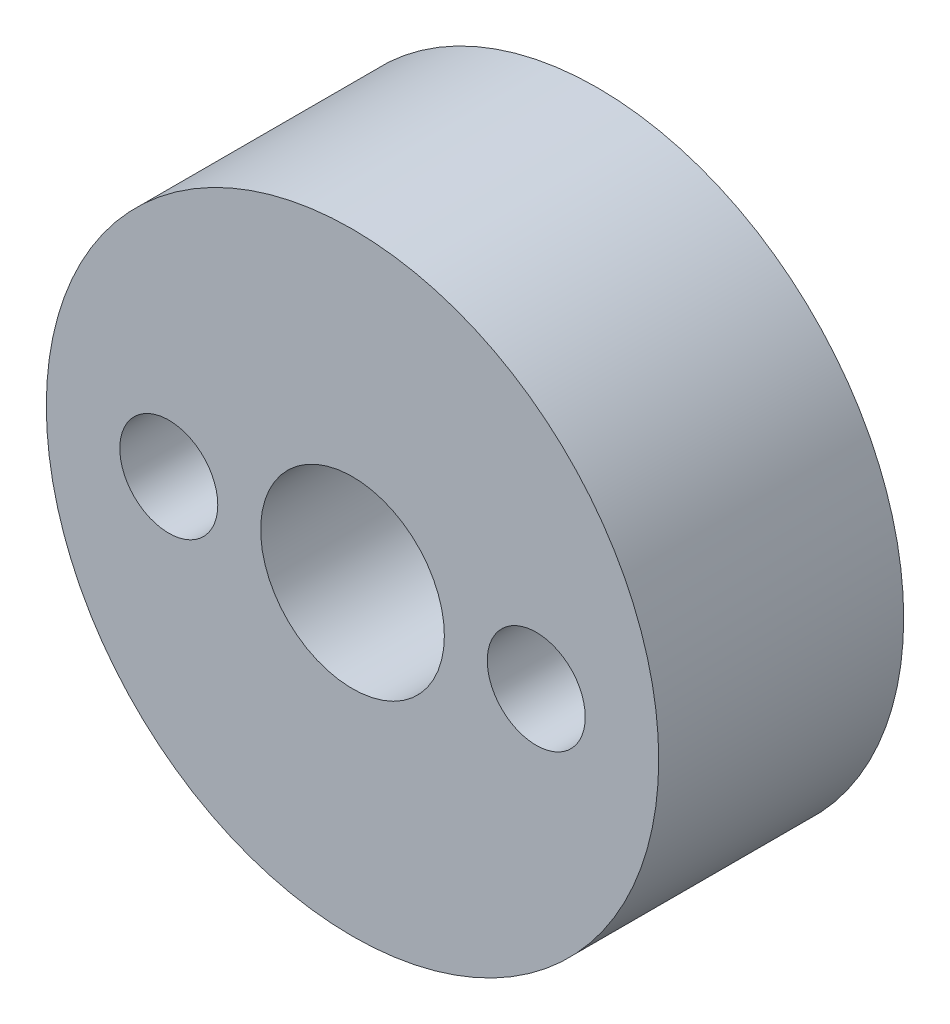
ISO-10303-21;
HEADER;
FILE_DESCRIPTION(('STEP AP214'),'2;1');
FILE_NAME('part.step','',(''),(''),'','','');
FILE_SCHEMA(('AUTOMOTIVE_DESIGN { 1 0 10303 214 1 1 1 1 }'));
ENDSEC;
DATA;
#1=APPLICATION_CONTEXT('core data for automotive mechanical design processes');
#2=APPLICATION_PROTOCOL_DEFINITION('international standard','automotive_design',2000,#1);
#3=PRODUCT_CONTEXT('',#1,'mechanical');
#4=PRODUCT('Part','Part','',(#3));
#5=PRODUCT_RELATED_PRODUCT_CATEGORY('part','',(#4));
#6=PRODUCT_DEFINITION_FORMATION('','',#4);
#7=PRODUCT_DEFINITION_CONTEXT('part definition',#1,'design');
#8=PRODUCT_DEFINITION('design','',#6,#7);
#9=PRODUCT_DEFINITION_SHAPE('','',#8);
#10=(LENGTH_UNIT() NAMED_UNIT(*) SI_UNIT(.MILLI.,.METRE.));
#11=(NAMED_UNIT(*) PLANE_ANGLE_UNIT() SI_UNIT($,.RADIAN.));
#12=(NAMED_UNIT(*) SI_UNIT($,.STERADIAN.) SOLID_ANGLE_UNIT());
#13=UNCERTAINTY_MEASURE_WITH_UNIT(LENGTH_MEASURE(1.E-05),#10,'distance_accuracy_value','');
#14=(GEOMETRIC_REPRESENTATION_CONTEXT(3) GLOBAL_UNCERTAINTY_ASSIGNED_CONTEXT((#13)) GLOBAL_UNIT_ASSIGNED_CONTEXT((#10,
#11,#12)) REPRESENTATION_CONTEXT('',''));
#15=CARTESIAN_POINT('',(0.,0.,0.));
#16=DIRECTION('',(0.,0.,1.));
#17=DIRECTION('',(1.,0.,0.));
#18=AXIS2_PLACEMENT_3D('',#15,#16,#17);
#19=CARTESIAN_POINT('',(0.,0.,8.));
#20=DIRECTION('',(0.,0.,1.));
#21=DIRECTION('',(1.,0.,0.));
#22=AXIS2_PLACEMENT_3D('',#19,#20,#21);
#23=PLANE('',#22);
#24=CARTESIAN_POINT('',(-6.,0.,8.));
#25=DIRECTION('',(0.,0.,1.));
#26=DIRECTION('',(1.,0.,0.));
#27=AXIS2_PLACEMENT_3D('',#24,#25,#26);
#28=CIRCLE('',#27,1.6);
#29=CARTESIAN_POINT('',(-4.4,0.,8.));
#30=VERTEX_POINT('',#29);
#31=EDGE_CURVE('E47',#30,#30,#28,.T.);
#32=ORIENTED_EDGE('',*,*,#31,.F.);
#33=EDGE_LOOP('',(#32));
#34=FACE_BOUND('',#33,.T.);
#35=CARTESIAN_POINT('',(0.,0.,8.));
#36=DIRECTION('',(0.,0.,1.));
#37=DIRECTION('',(1.,0.,0.));
#38=AXIS2_PLACEMENT_3D('',#35,#36,#37);
#39=CIRCLE('',#38,10.);
#40=CARTESIAN_POINT('',(10.,0.,8.));
#41=VERTEX_POINT('',#40);
#42=EDGE_CURVE('E10',#41,#41,#39,.T.);
#43=ORIENTED_EDGE('',*,*,#42,.T.);
#44=EDGE_LOOP('',(#43));
#45=FACE_BOUND('',#44,.T.);
#46=CARTESIAN_POINT('',(0.,0.,8.));
#47=DIRECTION('',(0.,0.,1.));
#48=DIRECTION('',(1.,0.,0.));
#49=AXIS2_PLACEMENT_3D('',#46,#47,#48);
#50=CIRCLE('',#49,3.);
#51=CARTESIAN_POINT('',(3.,0.,8.));
#52=VERTEX_POINT('',#51);
#53=EDGE_CURVE('E42',#52,#52,#50,.T.);
#54=ORIENTED_EDGE('',*,*,#53,.F.);
#55=EDGE_LOOP('',(#54));
#56=FACE_BOUND('',#55,.T.);
#57=CARTESIAN_POINT('',(6.,0.,8.));
#58=DIRECTION('',(0.,0.,1.));
#59=DIRECTION('',(1.,0.,0.));
#60=AXIS2_PLACEMENT_3D('',#57,#58,#59);
#61=CIRCLE('',#60,1.6);
#62=CARTESIAN_POINT('',(7.6,0.,8.));
#63=VERTEX_POINT('',#62);
#64=EDGE_CURVE('E53',#63,#63,#61,.T.);
#65=ORIENTED_EDGE('',*,*,#64,.F.);
#66=EDGE_LOOP('',(#65));
#67=FACE_BOUND('',#66,.T.);
#68=ADVANCED_FACE('F31',(#34,#45,#56,#67),#23,.T.);
#69=CARTESIAN_POINT('',(0.,0.,0.));
#70=DIRECTION('',(0.,0.,1.));
#71=DIRECTION('',(1.,0.,0.));
#72=AXIS2_PLACEMENT_3D('',#69,#70,#71);
#73=PLANE('',#72);
#74=CARTESIAN_POINT('',(0.,0.,0.));
#75=DIRECTION('',(0.,0.,1.));
#76=DIRECTION('',(1.,0.,0.));
#77=AXIS2_PLACEMENT_3D('',#74,#75,#76);
#78=CIRCLE('',#77,10.);
#79=CARTESIAN_POINT('',(10.,0.,0.));
#80=VERTEX_POINT('',#79);
#81=EDGE_CURVE('E35',#80,#80,#78,.T.);
#82=ORIENTED_EDGE('',*,*,#81,.F.);
#83=EDGE_LOOP('',(#82));
#84=FACE_BOUND('',#83,.T.);
#85=CARTESIAN_POINT('',(0.,0.,0.));
#86=DIRECTION('',(0.,0.,1.));
#87=DIRECTION('',(1.,0.,0.));
#88=AXIS2_PLACEMENT_3D('',#85,#86,#87);
#89=CIRCLE('',#88,3.);
#90=CARTESIAN_POINT('',(3.,0.,0.));
#91=VERTEX_POINT('',#90);
#92=EDGE_CURVE('E44',#91,#91,#89,.T.);
#93=ORIENTED_EDGE('',*,*,#92,.T.);
#94=EDGE_LOOP('',(#93));
#95=FACE_BOUND('',#94,.T.);
#96=CARTESIAN_POINT('',(-6.,0.,0.));
#97=DIRECTION('',(0.,0.,1.));
#98=DIRECTION('',(1.,0.,0.));
#99=AXIS2_PLACEMENT_3D('',#96,#97,#98);
#100=CIRCLE('',#99,1.6);
#101=CARTESIAN_POINT('',(-4.4,0.,0.));
#102=VERTEX_POINT('',#101);
#103=EDGE_CURVE('E50',#102,#102,#100,.T.);
#104=ORIENTED_EDGE('',*,*,#103,.T.);
#105=EDGE_LOOP('',(#104));
#106=FACE_BOUND('',#105,.T.);
#107=CARTESIAN_POINT('',(6.,0.,0.));
#108=DIRECTION('',(0.,0.,1.));
#109=DIRECTION('',(1.,0.,0.));
#110=AXIS2_PLACEMENT_3D('',#107,#108,#109);
#111=CIRCLE('',#110,1.6);
#112=CARTESIAN_POINT('',(7.6,0.,0.));
#113=VERTEX_POINT('',#112);
#114=EDGE_CURVE('E56',#113,#113,#111,.T.);
#115=ORIENTED_EDGE('',*,*,#114,.T.);
#116=EDGE_LOOP('',(#115));
#117=FACE_BOUND('',#116,.T.);
#118=ADVANCED_FACE('F66',(#84,#95,#106,#117),#73,.F.);
#119=CARTESIAN_POINT('',(0.,0.,8.));
#120=DIRECTION('',(0.,0.,-1.));
#121=DIRECTION('',(-1.,0.,0.));
#122=AXIS2_PLACEMENT_3D('',#119,#120,#121);
#123=CYLINDRICAL_SURFACE('',#122,10.);
#124=ORIENTED_EDGE('',*,*,#42,.F.);
#125=EDGE_LOOP('',(#124));
#126=FACE_BOUND('',#125,.T.);
#127=ORIENTED_EDGE('',*,*,#81,.T.);
#128=EDGE_LOOP('',(#127));
#129=FACE_BOUND('',#128,.T.);
#130=ADVANCED_FACE('F33',(#126,#129),#123,.T.);
#131=CARTESIAN_POINT('',(0.,0.,8.));
#132=DIRECTION('',(0.,0.,-1.));
#133=DIRECTION('',(-1.,0.,0.));
#134=AXIS2_PLACEMENT_3D('',#131,#132,#133);
#135=CYLINDRICAL_SURFACE('',#134,3.);
#136=ORIENTED_EDGE('',*,*,#53,.T.);
#137=EDGE_LOOP('',(#136));
#138=FACE_BOUND('',#137,.T.);
#139=ORIENTED_EDGE('',*,*,#92,.F.);
#140=EDGE_LOOP('',(#139));
#141=FACE_BOUND('',#140,.T.);
#142=ADVANCED_FACE('F75',(#138,#141),#135,.F.);
#143=CARTESIAN_POINT('',(-6.,0.,8.));
#144=DIRECTION('',(0.,0.,-1.));
#145=DIRECTION('',(-1.,0.,0.));
#146=AXIS2_PLACEMENT_3D('',#143,#144,#145);
#147=CYLINDRICAL_SURFACE('',#146,1.6);
#148=ORIENTED_EDGE('',*,*,#31,.T.);
#149=EDGE_LOOP('',(#148));
#150=FACE_BOUND('',#149,.T.);
#151=ORIENTED_EDGE('',*,*,#103,.F.);
#152=EDGE_LOOP('',(#151));
#153=FACE_BOUND('',#152,.T.);
#154=ADVANCED_FACE('F78',(#150,#153),#147,.F.);
#155=CARTESIAN_POINT('',(6.,0.,8.));
#156=DIRECTION('',(0.,0.,-1.));
#157=DIRECTION('',(-1.,0.,0.));
#158=AXIS2_PLACEMENT_3D('',#155,#156,#157);
#159=CYLINDRICAL_SURFACE('',#158,1.6);
#160=ORIENTED_EDGE('',*,*,#64,.T.);
#161=EDGE_LOOP('',(#160));
#162=FACE_BOUND('',#161,.T.);
#163=ORIENTED_EDGE('',*,*,#114,.F.);
#164=EDGE_LOOP('',(#163));
#165=FACE_BOUND('',#164,.T.);
#166=ADVANCED_FACE('F62',(#162,#165),#159,.F.);
#167=CLOSED_SHELL('',(#68,#118,#130,#142,#154,#166));
#168=MANIFOLD_SOLID_BREP('B2',#167);
#169=ADVANCED_BREP_SHAPE_REPRESENTATION('',(#18,#168),#14);
#170=SHAPE_DEFINITION_REPRESENTATION(#9,#169);
ENDSEC;
END-ISO-10303-21;
